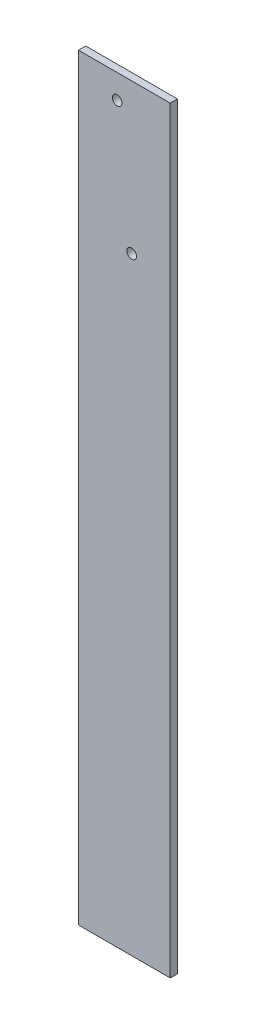
ISO-10303-21;
HEADER;
FILE_DESCRIPTION(('STEP AP214'),'2;1');
FILE_NAME('part.step','',(''),(''),'','','');
FILE_SCHEMA(('AUTOMOTIVE_DESIGN { 1 0 10303 214 1 1 1 1 }'));
ENDSEC;
DATA;
#1=APPLICATION_CONTEXT('core data for automotive mechanical design processes');
#2=APPLICATION_PROTOCOL_DEFINITION('international standard','automotive_design',2000,#1);
#3=PRODUCT_CONTEXT('',#1,'mechanical');
#4=PRODUCT('Part','Part','',(#3));
#5=PRODUCT_RELATED_PRODUCT_CATEGORY('part','',(#4));
#6=PRODUCT_DEFINITION_FORMATION('','',#4);
#7=PRODUCT_DEFINITION_CONTEXT('part definition',#1,'design');
#8=PRODUCT_DEFINITION('design','',#6,#7);
#9=PRODUCT_DEFINITION_SHAPE('','',#8);
#10=(LENGTH_UNIT() NAMED_UNIT(*) SI_UNIT(.MILLI.,.METRE.));
#11=(NAMED_UNIT(*) PLANE_ANGLE_UNIT() SI_UNIT($,.RADIAN.));
#12=(NAMED_UNIT(*) SI_UNIT($,.STERADIAN.) SOLID_ANGLE_UNIT());
#13=UNCERTAINTY_MEASURE_WITH_UNIT(LENGTH_MEASURE(1.E-05),#10,'distance_accuracy_value','');
#14=(GEOMETRIC_REPRESENTATION_CONTEXT(3) GLOBAL_UNCERTAINTY_ASSIGNED_CONTEXT((#13)) GLOBAL_UNIT_ASSIGNED_CONTEXT((#10,
#11,#12)) REPRESENTATION_CONTEXT('',''));
#15=CARTESIAN_POINT('',(0.,0.,0.));
#16=DIRECTION('',(0.,0.,1.));
#17=DIRECTION('',(1.,0.,0.));
#18=AXIS2_PLACEMENT_3D('',#15,#16,#17);
#19=CARTESIAN_POINT('',(57.,165.,3.));
#20=DIRECTION('',(1.,0.,0.));
#21=DIRECTION('',(0.,1.,0.));
#22=AXIS2_PLACEMENT_3D('',#19,#20,#21);
#23=PLANE('',#22);
#24=DIRECTION('',(0.,-1.,0.));
#25=VECTOR('',#24,1.);
#26=CARTESIAN_POINT('',(57.,165.,0.));
#27=LINE('',#26,#25);
#28=CARTESIAN_POINT('',(57.,165.,0.));
#29=VERTEX_POINT('',#28);
#30=CARTESIAN_POINT('',(57.,-149.,0.));
#31=VERTEX_POINT('',#30);
#32=EDGE_CURVE('E102',#29,#31,#27,.T.);
#33=ORIENTED_EDGE('',*,*,#32,.T.);
#34=DIRECTION('',(0.,0.,-1.));
#35=VECTOR('',#34,1.);
#36=CARTESIAN_POINT('',(57.,-149.,3.));
#37=LINE('',#36,#35);
#38=CARTESIAN_POINT('',(57.,-149.,3.));
#39=VERTEX_POINT('',#38);
#40=EDGE_CURVE('E11',#39,#31,#37,.T.);
#41=ORIENTED_EDGE('',*,*,#40,.F.);
#42=DIRECTION('',(0.,-1.,0.));
#43=VECTOR('',#42,1.);
#44=CARTESIAN_POINT('',(57.,165.,3.));
#45=LINE('',#44,#43);
#46=CARTESIAN_POINT('',(57.,165.,3.));
#47=VERTEX_POINT('',#46);
#48=EDGE_CURVE('E90',#47,#39,#45,.T.);
#49=ORIENTED_EDGE('',*,*,#48,.F.);
#50=DIRECTION('',(0.,0.,-1.));
#51=VECTOR('',#50,1.);
#52=CARTESIAN_POINT('',(57.,165.,3.));
#53=LINE('',#52,#51);
#54=EDGE_CURVE('E98',#47,#29,#53,.T.);
#55=ORIENTED_EDGE('',*,*,#54,.T.);
#56=EDGE_LOOP('',(#33,#41,#49,#55));
#57=FACE_BOUND('',#56,.T.);
#58=ADVANCED_FACE('F39',(#57),#23,.F.);
#59=CARTESIAN_POINT('',(95.,-149.,3.));
#60=DIRECTION('',(0.,1.,0.));
#61=DIRECTION('',(0.,0.,1.));
#62=AXIS2_PLACEMENT_3D('',#59,#60,#61);
#63=PLANE('',#62);
#64=DIRECTION('',(1.,0.,0.));
#65=VECTOR('',#64,1.);
#66=CARTESIAN_POINT('',(95.,-149.,0.));
#67=LINE('',#66,#65);
#68=CARTESIAN_POINT('',(95.,-149.,0.));
#69=VERTEX_POINT('',#68);
#70=EDGE_CURVE('E94',#31,#69,#67,.T.);
#71=ORIENTED_EDGE('',*,*,#70,.T.);
#72=DIRECTION('',(0.,0.,-1.));
#73=VECTOR('',#72,1.);
#74=CARTESIAN_POINT('',(95.,-149.,3.));
#75=LINE('',#74,#73);
#76=CARTESIAN_POINT('',(95.,-149.,3.));
#77=VERTEX_POINT('',#76);
#78=EDGE_CURVE('E47',#77,#69,#75,.T.);
#79=ORIENTED_EDGE('',*,*,#78,.F.);
#80=DIRECTION('',(1.,0.,0.));
#81=VECTOR('',#80,1.);
#82=CARTESIAN_POINT('',(95.,-149.,3.));
#83=LINE('',#82,#81);
#84=EDGE_CURVE('E85',#39,#77,#83,.T.);
#85=ORIENTED_EDGE('',*,*,#84,.F.);
#86=ORIENTED_EDGE('',*,*,#40,.T.);
#87=EDGE_LOOP('',(#71,#79,#85,#86));
#88=FACE_BOUND('',#87,.T.);
#89=ADVANCED_FACE('F93',(#88),#63,.F.);
#90=CARTESIAN_POINT('',(95.,165.,3.));
#91=DIRECTION('',(-1.,0.,0.));
#92=DIRECTION('',(0.,-1.,0.));
#93=AXIS2_PLACEMENT_3D('',#90,#91,#92);
#94=PLANE('',#93);
#95=DIRECTION('',(0.,1.,0.));
#96=VECTOR('',#95,1.);
#97=CARTESIAN_POINT('',(95.,165.,0.));
#98=LINE('',#97,#96);
#99=CARTESIAN_POINT('',(95.,165.,0.));
#100=VERTEX_POINT('',#99);
#101=EDGE_CURVE('E72',#69,#100,#98,.T.);
#102=ORIENTED_EDGE('',*,*,#101,.T.);
#103=DIRECTION('',(0.,0.,-1.));
#104=VECTOR('',#103,1.);
#105=CARTESIAN_POINT('',(95.,165.,3.));
#106=LINE('',#105,#104);
#107=CARTESIAN_POINT('',(95.,165.,3.));
#108=VERTEX_POINT('',#107);
#109=EDGE_CURVE('E95',#108,#100,#106,.T.);
#110=ORIENTED_EDGE('',*,*,#109,.F.);
#111=DIRECTION('',(0.,1.,0.));
#112=VECTOR('',#111,1.);
#113=CARTESIAN_POINT('',(95.,165.,3.));
#114=LINE('',#113,#112);
#115=EDGE_CURVE('E88',#77,#108,#114,.T.);
#116=ORIENTED_EDGE('',*,*,#115,.F.);
#117=ORIENTED_EDGE('',*,*,#78,.T.);
#118=EDGE_LOOP('',(#102,#110,#116,#117));
#119=FACE_BOUND('',#118,.T.);
#120=ADVANCED_FACE('F96',(#119),#94,.F.);
#121=CARTESIAN_POINT('',(57.,165.,3.));
#122=DIRECTION('',(0.,-1.,0.));
#123=DIRECTION('',(0.,0.,-1.));
#124=AXIS2_PLACEMENT_3D('',#121,#122,#123);
#125=PLANE('',#124);
#126=DIRECTION('',(-1.,0.,0.));
#127=VECTOR('',#126,1.);
#128=CARTESIAN_POINT('',(57.,165.,0.));
#129=LINE('',#128,#127);
#130=EDGE_CURVE('E78',#100,#29,#129,.T.);
#131=ORIENTED_EDGE('',*,*,#130,.T.);
#132=ORIENTED_EDGE('',*,*,#54,.F.);
#133=DIRECTION('',(-1.,0.,0.));
#134=VECTOR('',#133,1.);
#135=CARTESIAN_POINT('',(57.,165.,3.));
#136=LINE('',#135,#134);
#137=EDGE_CURVE('E55',#108,#47,#136,.T.);
#138=ORIENTED_EDGE('',*,*,#137,.F.);
#139=ORIENTED_EDGE('',*,*,#109,.T.);
#140=EDGE_LOOP('',(#131,#132,#138,#139));
#141=FACE_BOUND('',#140,.T.);
#142=ADVANCED_FACE('F110',(#141),#125,.F.);
#143=CARTESIAN_POINT('',(0.,0.,3.));
#144=DIRECTION('',(0.,0.,-1.));
#145=DIRECTION('',(-1.,0.,0.));
#146=AXIS2_PLACEMENT_3D('',#143,#144,#145);
#147=PLANE('',#146);
#148=CARTESIAN_POINT('',(73.,155.,3.));
#149=DIRECTION('',(0.,0.,1.));
#150=DIRECTION('',(1.,0.,0.));
#151=AXIS2_PLACEMENT_3D('',#148,#149,#150);
#152=CIRCLE('',#151,2.);
#153=CARTESIAN_POINT('',(75.,155.,3.));
#154=VERTEX_POINT('',#153);
#155=EDGE_CURVE('E105',#154,#154,#152,.T.);
#156=ORIENTED_EDGE('',*,*,#155,.F.);
#157=EDGE_LOOP('',(#156));
#158=FACE_BOUND('',#157,.T.);
#159=CARTESIAN_POINT('',(79.,103.,3.));
#160=DIRECTION('',(0.,0.,1.));
#161=DIRECTION('',(1.,0.,0.));
#162=AXIS2_PLACEMENT_3D('',#159,#160,#161);
#163=CIRCLE('',#162,2.);
#164=CARTESIAN_POINT('',(81.,103.,3.));
#165=VERTEX_POINT('',#164);
#166=EDGE_CURVE('E119',#165,#165,#163,.T.);
#167=ORIENTED_EDGE('',*,*,#166,.F.);
#168=EDGE_LOOP('',(#167));
#169=FACE_BOUND('',#168,.T.);
#170=ORIENTED_EDGE('',*,*,#48,.T.);
#171=ORIENTED_EDGE('',*,*,#84,.T.);
#172=ORIENTED_EDGE('',*,*,#115,.T.);
#173=ORIENTED_EDGE('',*,*,#137,.T.);
#174=EDGE_LOOP('',(#170,#171,#172,#173));
#175=FACE_BOUND('',#174,.T.);
#176=ADVANCED_FACE('F86',(#158,#169,#175),#147,.F.);
#177=CARTESIAN_POINT('',(0.,0.,0.));
#178=DIRECTION('',(0.,0.,-1.));
#179=DIRECTION('',(-1.,0.,0.));
#180=AXIS2_PLACEMENT_3D('',#177,#178,#179);
#181=PLANE('',#180);
#182=CARTESIAN_POINT('',(73.,155.,0.));
#183=DIRECTION('',(0.,0.,-1.));
#184=DIRECTION('',(-1.,0.,0.));
#185=AXIS2_PLACEMENT_3D('',#182,#183,#184);
#186=CIRCLE('',#185,2.);
#187=CARTESIAN_POINT('',(75.,155.,0.));
#188=VERTEX_POINT('',#187);
#189=EDGE_CURVE('E122',#188,#188,#186,.F.);
#190=ORIENTED_EDGE('',*,*,#189,.T.);
#191=EDGE_LOOP('',(#190));
#192=FACE_BOUND('',#191,.T.);
#193=CARTESIAN_POINT('',(79.,103.,0.));
#194=DIRECTION('',(0.,0.,-1.));
#195=DIRECTION('',(-1.,0.,0.));
#196=AXIS2_PLACEMENT_3D('',#193,#194,#195);
#197=CIRCLE('',#196,2.);
#198=CARTESIAN_POINT('',(81.,103.,0.));
#199=VERTEX_POINT('',#198);
#200=EDGE_CURVE('E116',#199,#199,#197,.F.);
#201=ORIENTED_EDGE('',*,*,#200,.T.);
#202=EDGE_LOOP('',(#201));
#203=FACE_BOUND('',#202,.T.);
#204=ORIENTED_EDGE('',*,*,#32,.F.);
#205=ORIENTED_EDGE('',*,*,#130,.F.);
#206=ORIENTED_EDGE('',*,*,#101,.F.);
#207=ORIENTED_EDGE('',*,*,#70,.F.);
#208=EDGE_LOOP('',(#204,#205,#206,#207));
#209=FACE_BOUND('',#208,.T.);
#210=ADVANCED_FACE('F113',(#192,#203,#209),#181,.T.);
#211=CARTESIAN_POINT('',(79.,103.,-0.00100000000000013));
#212=DIRECTION('',(0.,0.,1.));
#213=DIRECTION('',(1.,0.,0.));
#214=AXIS2_PLACEMENT_3D('',#211,#212,#213);
#215=CYLINDRICAL_SURFACE('',#214,2.);
#216=CARTESIAN_POINT('',(81.,103.,0.));
#217=CARTESIAN_POINT('',(81.,103.,0.03125));
#218=CARTESIAN_POINT('',(81.,103.,0.0625));
#219=CARTESIAN_POINT('',(81.,103.,0.125));
#220=CARTESIAN_POINT('',(81.,103.,0.15625));
#221=CARTESIAN_POINT('',(81.,103.,0.21875));
#222=CARTESIAN_POINT('',(81.,103.,0.25));
#223=CARTESIAN_POINT('',(81.,103.,0.3125));
#224=CARTESIAN_POINT('',(81.,103.,0.34375));
#225=CARTESIAN_POINT('',(81.,103.,0.40625));
#226=CARTESIAN_POINT('',(81.,103.,0.4375));
#227=CARTESIAN_POINT('',(81.,103.,0.5));
#228=CARTESIAN_POINT('',(81.,103.,0.53125));
#229=CARTESIAN_POINT('',(81.,103.,0.59375));
#230=CARTESIAN_POINT('',(81.,103.,0.625));
#231=CARTESIAN_POINT('',(81.,103.,0.6875));
#232=CARTESIAN_POINT('',(81.,103.,0.71875));
#233=CARTESIAN_POINT('',(81.,103.,0.78125));
#234=CARTESIAN_POINT('',(81.,103.,0.8125));
#235=CARTESIAN_POINT('',(81.,103.,0.875));
#236=CARTESIAN_POINT('',(81.,103.,0.90625));
#237=CARTESIAN_POINT('',(81.,103.,0.96875));
#238=CARTESIAN_POINT('',(81.,103.,1.));
#239=CARTESIAN_POINT('',(81.,103.,1.0625));
#240=CARTESIAN_POINT('',(81.,103.,1.09375));
#241=CARTESIAN_POINT('',(81.,103.,1.15625));
#242=CARTESIAN_POINT('',(81.,103.,1.1875));
#243=CARTESIAN_POINT('',(81.,103.,1.25));
#244=CARTESIAN_POINT('',(81.,103.,1.28125));
#245=CARTESIAN_POINT('',(81.,103.,1.34375));
#246=CARTESIAN_POINT('',(81.,103.,1.375));
#247=CARTESIAN_POINT('',(81.,103.,1.4375));
#248=CARTESIAN_POINT('',(81.,103.,1.46875));
#249=CARTESIAN_POINT('',(81.,103.,1.53125));
#250=CARTESIAN_POINT('',(81.,103.,1.5625));
#251=CARTESIAN_POINT('',(81.,103.,1.625));
#252=CARTESIAN_POINT('',(81.,103.,1.65625));
#253=CARTESIAN_POINT('',(81.,103.,1.71875));
#254=CARTESIAN_POINT('',(81.,103.,1.75));
#255=CARTESIAN_POINT('',(81.,103.,1.8125));
#256=CARTESIAN_POINT('',(81.,103.,1.84375));
#257=CARTESIAN_POINT('',(81.,103.,1.90625));
#258=CARTESIAN_POINT('',(81.,103.,1.9375));
#259=CARTESIAN_POINT('',(81.,103.,2.));
#260=CARTESIAN_POINT('',(81.,103.,2.03125));
#261=CARTESIAN_POINT('',(81.,103.,2.09375));
#262=CARTESIAN_POINT('',(81.,103.,2.125));
#263=CARTESIAN_POINT('',(81.,103.,2.1875));
#264=CARTESIAN_POINT('',(81.,103.,2.21875));
#265=CARTESIAN_POINT('',(81.,103.,2.28125));
#266=CARTESIAN_POINT('',(81.,103.,2.3125));
#267=CARTESIAN_POINT('',(81.,103.,2.375));
#268=CARTESIAN_POINT('',(81.,103.,2.40625));
#269=CARTESIAN_POINT('',(81.,103.,2.46875));
#270=CARTESIAN_POINT('',(81.,103.,2.5));
#271=CARTESIAN_POINT('',(81.,103.,2.5625));
#272=CARTESIAN_POINT('',(81.,103.,2.59375));
#273=CARTESIAN_POINT('',(81.,103.,2.65625));
#274=CARTESIAN_POINT('',(81.,103.,2.6875));
#275=CARTESIAN_POINT('',(81.,103.,2.75));
#276=CARTESIAN_POINT('',(81.,103.,2.78125));
#277=CARTESIAN_POINT('',(81.,103.,2.84375));
#278=CARTESIAN_POINT('',(81.,103.,2.875));
#279=CARTESIAN_POINT('',(81.,103.,2.9375));
#280=CARTESIAN_POINT('',(81.,103.,2.96875));
#281=CARTESIAN_POINT('',(81.,103.,3.));
#282=B_SPLINE_CURVE_WITH_KNOTS('',3,(#216,#217,#218,#219,#220,#221,#222,#223,#224,#225,#226,
#227,#228,#229,#230,#231,#232,#233,#234,#235,#236,#237,#238,#239,#240,#241,#242,#243,#244,#245,
#246,#247,#248,#249,#250,#251,#252,#253,#254,#255,#256,#257,#258,#259,#260,#261,#262,#263,#264,
#265,#266,#267,#268,#269,#270,#271,#272,#273,#274,#275,#276,#277,#278,#279,#280,#281),
.UNSPECIFIED.,.F.,.F.,(4,2,2,2,2,2,2,2,2,2,2,2,2,2,2,2,2,2,2,2,2,2,2,2,2,2,2,2,2,2,2,2,4),(0.,
0.09375,0.1875,0.28125,0.375,0.46875,0.5625,0.65625,0.75,0.84375,0.9375,1.03125,1.125,1.21875,
1.3125,1.40625,1.5,1.59375,1.6875,1.78125,1.875,1.96875,2.0625,2.15625,2.25,2.34375,2.4375,
2.53125,2.625,2.71875,2.8125,2.90625,3.),.UNSPECIFIED.);
#283=EDGE_CURVE('BSEAM135',#199,#165,#282,.T.);
#284=ORIENTED_EDGE('',*,*,#200,.F.);
#285=ORIENTED_EDGE('',*,*,#166,.T.);
#286=ORIENTED_EDGE('',*,*,#283,.T.);
#287=ORIENTED_EDGE('',*,*,#283,.F.);
#288=EDGE_LOOP('',(#284,#286,#285,#287));
#289=FACE_BOUND('',#288,.T.);
#290=ADVANCED_FACE('F135',(#289),#215,.F.);
#291=CARTESIAN_POINT('',(73.,155.,-0.00100000000000013));
#292=DIRECTION('',(0.,0.,1.));
#293=DIRECTION('',(1.,0.,0.));
#294=AXIS2_PLACEMENT_3D('',#291,#292,#293);
#295=CYLINDRICAL_SURFACE('',#294,2.);
#296=CARTESIAN_POINT('',(75.,155.,0.));
#297=CARTESIAN_POINT('',(75.,155.,0.03125));
#298=CARTESIAN_POINT('',(75.,155.,0.0625));
#299=CARTESIAN_POINT('',(75.,155.,0.125));
#300=CARTESIAN_POINT('',(75.,155.,0.15625));
#301=CARTESIAN_POINT('',(75.,155.,0.21875));
#302=CARTESIAN_POINT('',(75.,155.,0.25));
#303=CARTESIAN_POINT('',(75.,155.,0.3125));
#304=CARTESIAN_POINT('',(75.,155.,0.34375));
#305=CARTESIAN_POINT('',(75.,155.,0.40625));
#306=CARTESIAN_POINT('',(75.,155.,0.4375));
#307=CARTESIAN_POINT('',(75.,155.,0.5));
#308=CARTESIAN_POINT('',(75.,155.,0.53125));
#309=CARTESIAN_POINT('',(75.,155.,0.59375));
#310=CARTESIAN_POINT('',(75.,155.,0.625));
#311=CARTESIAN_POINT('',(75.,155.,0.6875));
#312=CARTESIAN_POINT('',(75.,155.,0.71875));
#313=CARTESIAN_POINT('',(75.,155.,0.78125));
#314=CARTESIAN_POINT('',(75.,155.,0.8125));
#315=CARTESIAN_POINT('',(75.,155.,0.875));
#316=CARTESIAN_POINT('',(75.,155.,0.90625));
#317=CARTESIAN_POINT('',(75.,155.,0.96875));
#318=CARTESIAN_POINT('',(75.,155.,1.));
#319=CARTESIAN_POINT('',(75.,155.,1.0625));
#320=CARTESIAN_POINT('',(75.,155.,1.09375));
#321=CARTESIAN_POINT('',(75.,155.,1.15625));
#322=CARTESIAN_POINT('',(75.,155.,1.1875));
#323=CARTESIAN_POINT('',(75.,155.,1.25));
#324=CARTESIAN_POINT('',(75.,155.,1.28125));
#325=CARTESIAN_POINT('',(75.,155.,1.34375));
#326=CARTESIAN_POINT('',(75.,155.,1.375));
#327=CARTESIAN_POINT('',(75.,155.,1.4375));
#328=CARTESIAN_POINT('',(75.,155.,1.46875));
#329=CARTESIAN_POINT('',(75.,155.,1.53125));
#330=CARTESIAN_POINT('',(75.,155.,1.5625));
#331=CARTESIAN_POINT('',(75.,155.,1.625));
#332=CARTESIAN_POINT('',(75.,155.,1.65625));
#333=CARTESIAN_POINT('',(75.,155.,1.71875));
#334=CARTESIAN_POINT('',(75.,155.,1.75));
#335=CARTESIAN_POINT('',(75.,155.,1.8125));
#336=CARTESIAN_POINT('',(75.,155.,1.84375));
#337=CARTESIAN_POINT('',(75.,155.,1.90625));
#338=CARTESIAN_POINT('',(75.,155.,1.9375));
#339=CARTESIAN_POINT('',(75.,155.,2.));
#340=CARTESIAN_POINT('',(75.,155.,2.03125));
#341=CARTESIAN_POINT('',(75.,155.,2.09375));
#342=CARTESIAN_POINT('',(75.,155.,2.125));
#343=CARTESIAN_POINT('',(75.,155.,2.1875));
#344=CARTESIAN_POINT('',(75.,155.,2.21875));
#345=CARTESIAN_POINT('',(75.,155.,2.28125));
#346=CARTESIAN_POINT('',(75.,155.,2.3125));
#347=CARTESIAN_POINT('',(75.,155.,2.375));
#348=CARTESIAN_POINT('',(75.,155.,2.40625));
#349=CARTESIAN_POINT('',(75.,155.,2.46875));
#350=CARTESIAN_POINT('',(75.,155.,2.5));
#351=CARTESIAN_POINT('',(75.,155.,2.5625));
#352=CARTESIAN_POINT('',(75.,155.,2.59375));
#353=CARTESIAN_POINT('',(75.,155.,2.65625));
#354=CARTESIAN_POINT('',(75.,155.,2.6875));
#355=CARTESIAN_POINT('',(75.,155.,2.75));
#356=CARTESIAN_POINT('',(75.,155.,2.78125));
#357=CARTESIAN_POINT('',(75.,155.,2.84375));
#358=CARTESIAN_POINT('',(75.,155.,2.875));
#359=CARTESIAN_POINT('',(75.,155.,2.9375));
#360=CARTESIAN_POINT('',(75.,155.,2.96875));
#361=CARTESIAN_POINT('',(75.,155.,3.));
#362=B_SPLINE_CURVE_WITH_KNOTS('',3,(#296,#297,#298,#299,#300,#301,#302,#303,#304,#305,#306,
#307,#308,#309,#310,#311,#312,#313,#314,#315,#316,#317,#318,#319,#320,#321,#322,#323,#324,#325,
#326,#327,#328,#329,#330,#331,#332,#333,#334,#335,#336,#337,#338,#339,#340,#341,#342,#343,#344,
#345,#346,#347,#348,#349,#350,#351,#352,#353,#354,#355,#356,#357,#358,#359,#360,#361),
.UNSPECIFIED.,.F.,.F.,(4,2,2,2,2,2,2,2,2,2,2,2,2,2,2,2,2,2,2,2,2,2,2,2,2,2,2,2,2,2,2,2,4),(0.,
0.09375,0.1875,0.28125,0.375,0.46875,0.5625,0.65625,0.75,0.84375,0.9375,1.03125,1.125,1.21875,
1.3125,1.40625,1.5,1.59375,1.6875,1.78125,1.875,1.96875,2.0625,2.15625,2.25,2.34375,2.4375,
2.53125,2.625,2.71875,2.8125,2.90625,3.),.UNSPECIFIED.);
#363=EDGE_CURVE('BSEAM128',#188,#154,#362,.T.);
#364=ORIENTED_EDGE('',*,*,#189,.F.);
#365=ORIENTED_EDGE('',*,*,#155,.T.);
#366=ORIENTED_EDGE('',*,*,#363,.T.);
#367=ORIENTED_EDGE('',*,*,#363,.F.);
#368=EDGE_LOOP('',(#364,#366,#365,#367));
#369=FACE_BOUND('',#368,.T.);
#370=ADVANCED_FACE('F128',(#369),#295,.F.);
#371=CLOSED_SHELL('',(#58,#89,#120,#142,#176,#210,#290,#370));
#372=MANIFOLD_SOLID_BREP('B2',#371);
#373=ADVANCED_BREP_SHAPE_REPRESENTATION('',(#18,#372),#14);
#374=SHAPE_DEFINITION_REPRESENTATION(#9,#373);
ENDSEC;
END-ISO-10303-21;
